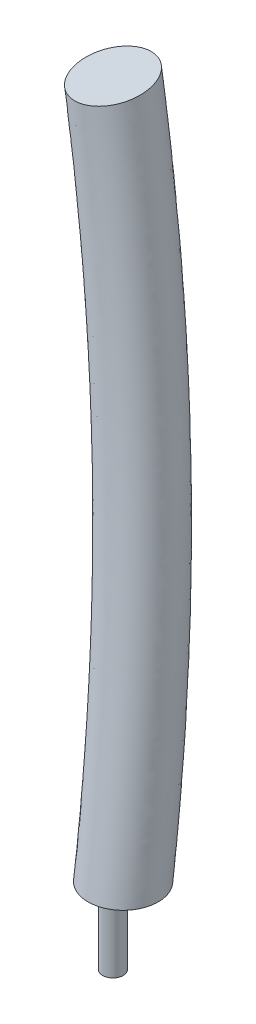
ISO-10303-21;
HEADER;
FILE_DESCRIPTION(('STEP AP214'),'2;1');
FILE_NAME('part.step','',(''),(''),'','','');
FILE_SCHEMA(('AUTOMOTIVE_DESIGN { 1 0 10303 214 1 1 1 1 }'));
ENDSEC;
DATA;
#1=APPLICATION_CONTEXT('core data for automotive mechanical design processes');
#2=APPLICATION_PROTOCOL_DEFINITION('international standard','automotive_design',2000,#1);
#3=PRODUCT_CONTEXT('',#1,'mechanical');
#4=PRODUCT('Part','Part','',(#3));
#5=PRODUCT_RELATED_PRODUCT_CATEGORY('part','',(#4));
#6=PRODUCT_DEFINITION_FORMATION('','',#4);
#7=PRODUCT_DEFINITION_CONTEXT('part definition',#1,'design');
#8=PRODUCT_DEFINITION('design','',#6,#7);
#9=PRODUCT_DEFINITION_SHAPE('','',#8);
#10=(LENGTH_UNIT() NAMED_UNIT(*) SI_UNIT(.MILLI.,.METRE.));
#11=(NAMED_UNIT(*) PLANE_ANGLE_UNIT() SI_UNIT($,.RADIAN.));
#12=(NAMED_UNIT(*) SI_UNIT($,.STERADIAN.) SOLID_ANGLE_UNIT());
#13=UNCERTAINTY_MEASURE_WITH_UNIT(LENGTH_MEASURE(1.E-05),#10,'distance_accuracy_value','');
#14=(GEOMETRIC_REPRESENTATION_CONTEXT(3) GLOBAL_UNCERTAINTY_ASSIGNED_CONTEXT((#13)) GLOBAL_UNIT_ASSIGNED_CONTEXT((#10,
#11,#12)) REPRESENTATION_CONTEXT('',''));
#15=CARTESIAN_POINT('',(0.,0.,0.));
#16=DIRECTION('',(0.,0.,1.));
#17=DIRECTION('',(1.,0.,0.));
#18=AXIS2_PLACEMENT_3D('',#15,#16,#17);
#19=CARTESIAN_POINT('',(0.,0.,0.));
#20=DIRECTION('',(0.,1.,0.));
#21=DIRECTION('',(0.,0.,1.));
#22=AXIS2_PLACEMENT_3D('',#19,#20,#21);
#23=PLANE('',#22);
#24=CARTESIAN_POINT('',(1.00340008736,0.,0.));
#25=DIRECTION('',(0.,-1.,0.));
#26=DIRECTION('',(0.,0.,-1.));
#27=AXIS2_PLACEMENT_3D('',#24,#25,#26);
#28=CIRCLE('',#27,0.146623174374);
#29=CARTESIAN_POINT('',(1.00340008736,0.,-0.146623174374));
#30=VERTEX_POINT('',#29);
#31=EDGE_CURVE('E17',#30,#30,#28,.F.);
#32=ORIENTED_EDGE('',*,*,#31,.F.);
#33=EDGE_LOOP('',(#32));
#34=FACE_BOUND('',#33,.T.);
#35=ADVANCED_FACE('F14',(#34),#23,.F.);
#36=CARTESIAN_POINT('',(1.00340008736,0.5,0.));
#37=DIRECTION('',(0.,-1.,0.));
#38=DIRECTION('',(0.,0.,-1.));
#39=AXIS2_PLACEMENT_3D('',#36,#37,#38);
#40=CYLINDRICAL_SURFACE('',#39,0.146623174374);
#41=ORIENTED_EDGE('',*,*,#31,.T.);
#42=EDGE_LOOP('',(#41));
#43=FACE_BOUND('',#42,.T.);
#44=CARTESIAN_POINT('',(1.00340008736,1.,0.));
#45=DIRECTION('',(0.,-1.,0.));
#46=DIRECTION('',(0.,0.,-1.));
#47=AXIS2_PLACEMENT_3D('',#44,#45,#46);
#48=CIRCLE('',#47,0.146623174374);
#49=CARTESIAN_POINT('',(1.00340008736,1.,-0.146623174374));
#50=VERTEX_POINT('',#49);
#51=EDGE_CURVE('E26',#50,#50,#48,.F.);
#52=ORIENTED_EDGE('',*,*,#51,.F.);
#53=EDGE_LOOP('',(#52));
#54=FACE_BOUND('',#53,.T.);
#55=ADVANCED_FACE('F48',(#43,#54),#40,.T.);
#56=CARTESIAN_POINT('',(-0.987813341373,9.84483464318,-0.987813341373));
#57=DIRECTION('',(-0.151428996103013,0.976213588915081,0.155165356819013));
#58=DIRECTION('',(0.,-0.156975577572689,0.987602484831686));
#59=AXIS2_PLACEMENT_3D('',#56,#57,#58);
#60=PLANE('',#59);
#61=CARTESIAN_POINT('',(0.498737043407666,10.078341431587,-1.00615292165044));
#62=CARTESIAN_POINT('',(0.497725032690783,10.082591541877,-1.03387987868986));
#63=CARTESIAN_POINT('',(0.494373261988579,10.0864781248545,-1.06160314427991));
#64=CARTESIAN_POINT('',(0.483065210497733,10.0934102728523,-1.11625209516348));
#65=CARTESIAN_POINT('',(0.475099079707696,10.0964540181091,-1.14317594433818));
#66=CARTESIAN_POINT('',(0.454794698370169,10.1016029884781,-1.19538583893637));
#67=CARTESIAN_POINT('',(0.442461282069797,10.1037092455222,-1.22067365885934));
#68=CARTESIAN_POINT('',(0.413769288119272,10.1069276903036,-1.26892340689998));
#69=CARTESIAN_POINT('',(0.397410432484347,10.1080398093641,-1.29188517423278));
#70=CARTESIAN_POINT('',(0.361133996146727,10.1092383208552,-1.33482844247346));
#71=CARTESIAN_POINT('',(0.341216691621509,10.109324792853,-1.35481017444646));
#72=CARTESIAN_POINT('',(0.298385904460319,10.1084696644533,-1.39122961277405));
#73=CARTESIAN_POINT('',(0.275472164027475,10.1075279755472,-1.40766701387121));
#74=CARTESIAN_POINT('',(0.227316999190403,10.1046441371718,-1.43651911172321));
#75=CARTESIAN_POINT('',(0.202077178675149,10.1027026728967,-1.44893655406881));
#76=CARTESIAN_POINT('',(0.149938410571271,10.0978715786143,-1.46942528611574));
#77=CARTESIAN_POINT('',(0.123037374805347,10.0949807346766,-1.47749097634059));
#78=CARTESIAN_POINT('',(0.0683878509593497,10.0883358724088,-1.48901879240237));
#79=CARTESIAN_POINT('',(0.0406399171575683,10.0845824085693,-1.49248386585291));
#80=CARTESIAN_POINT('',(-0.014932231832681,10.0763178326587,-1.49472175857161));
#81=CARTESIAN_POINT('',(-0.0427564470211329,10.0718067205878,-1.49349457784076));
#82=CARTESIAN_POINT('',(-0.0977090277096719,10.0621517830399,-1.48638044405306));
#83=CARTESIAN_POINT('',(-0.124836935509163,10.0570075536514,-1.48049050313132));
#84=CARTESIAN_POINT('',(-0.177573211412269,10.0462418466842,-1.46422509332441));
#85=CARTESIAN_POINT('',(-0.203183482698281,10.040620989297,-1.45385538369066));
#86=CARTESIAN_POINT('',(-0.252213428377985,10.029051630843,-1.42891676616804));
#87=CARTESIAN_POINT('',(-0.275631562311368,10.0231029039707,-1.41434493427163));
#88=CARTESIAN_POINT('',(-0.319589595522292,10.0110509592068,-1.38142037230943));
#89=CARTESIAN_POINT('',(-0.340129815495306,10.0049477586182,-1.36306806407851));
#90=CARTESIAN_POINT('',(-0.377754009526942,9.99275892538686,-1.32310095524889));
#91=CARTESIAN_POINT('',(-0.394837644235653,9.98667329452675,-1.30148583468729));
#92=CARTESIAN_POINT('',(-0.425059846900371,9.97469319996006,-1.25560824027096));
#93=CARTESIAN_POINT('',(-0.438198748927434,9.96879872010305,-1.23134599083336));
#94=CARTESIAN_POINT('',(-0.460174262572766,9.95736158524339,-1.18083628520313));
#95=CARTESIAN_POINT('',(-0.469005449120234,9.95181938148791,-1.15458637356935));
#96=CARTESIAN_POINT('',(-0.482073904425944,9.94126132305159,-1.10091474723961));
#97=CARTESIAN_POINT('',(-0.486322259470486,9.93624422478881,-1.07349602795208));
#98=CARTESIAN_POINT('',(-0.488828504751866,9.93009889668952,-1.03727895795079));
#99=CARTESIAN_POINT('',(-0.489196855191389,9.92866898545131,-1.02864223728606));
#100=CARTESIAN_POINT('',(-0.489408716762604,9.92657291933562,-1.01566172228639));
#101=CARTESIAN_POINT('',(-0.489422362619063,9.92588152886055,-1.01132519760545));
#102=CARTESIAN_POINT('',(-0.489357004661403,9.92485736960208,-1.00481797657496));
#103=CARTESIAN_POINT('',(-0.489320889344233,9.92451803289411,-1.00264781425666));
#104=CARTESIAN_POINT('',(-0.489220078664886,9.92384375250099,-0.998307236178757));
#105=CARTESIAN_POINT('',(-0.489155378337223,9.9235088095895,-0.996136820440649));
#106=CARTESIAN_POINT('',(-0.488067005482243,9.91892942361387,-0.966263721296195));
#107=CARTESIAN_POINT('',(-0.484715335515416,9.91504245067363,-0.938538100945214));
#108=CARTESIAN_POINT('',(-0.473408949093362,9.90810863677796,-0.883880294389451));
#109=CARTESIAN_POINT('',(-0.465441427668377,9.90506416789673,-0.856950535319028));
#110=CARTESIAN_POINT('',(-0.445134285439064,9.89991470683309,-0.804734859067979));
#111=CARTESIAN_POINT('',(-0.43280097834672,9.89780836782769,-0.779446630109266));
#112=CARTESIAN_POINT('',(-0.404109020842538,9.89458981221074,-0.731196220338312));
#113=CARTESIAN_POINT('',(-0.387749963893745,9.89347769605254,-0.708234274774638));
#114=CARTESIAN_POINT('',(-0.351473692880197,9.89227921017724,-0.665291329025338));
#115=CARTESIAN_POINT('',(-0.331556896114455,9.89219272024115,-0.645309979739618));
#116=CARTESIAN_POINT('',(-0.28872624379176,9.89304779451462,-0.608890332503855));
#117=CARTESIAN_POINT('',(-0.265811988683068,9.893989495902,-0.592452507669299));
#118=CARTESIAN_POINT('',(-0.217656248756994,9.89687337021237,-0.563600074660188));
#119=CARTESIAN_POINT('',(-0.192416422829212,9.89881483444628,-0.551182626754302));
#120=CARTESIAN_POINT('',(-0.140277654085088,9.90364592871759,-0.530693893975715));
#121=CARTESIAN_POINT('',(-0.113376623758767,9.90653677229846,-0.522628206796289));
#122=CARTESIAN_POINT('',(-0.0587271055302983,9.91318163399333,-0.511100392622242));
#123=CARTESIAN_POINT('',(-0.0309791717295904,9.91693509779372,-0.507635318955309));
#124=CARTESIAN_POINT('',(0.0245929772589981,9.92519967366125,-0.505397425963911));
#125=CARTESIAN_POINT('',(0.052417192446908,9.92971078572869,-0.506624606641265));
#126=CARTESIAN_POINT('',(0.107369776114257,9.939365723859,-0.513738741186324));
#127=CARTESIAN_POINT('',(0.134497686816586,9.94450995390106,-0.519628683418865));
#128=CARTESIAN_POINT('',(0.187233962371867,9.95527566077405,-0.535894092975803));
#129=CARTESIAN_POINT('',(0.212844230726452,9.96089651731005,-0.546263800086054));
#130=CARTESIAN_POINT('',(0.261873862472814,9.97246580239057,-0.571202262346715));
#131=CARTESIAN_POINT('',(0.285291713239155,9.97841445266126,-0.585773888675796));
#132=CARTESIAN_POINT('',(0.329249815068812,9.99046638966751,-0.618698334904613));
#133=CARTESIAN_POINT('',(0.34979031379796,9.99656966304052,-0.637050829032725));
#134=CARTESIAN_POINT('',(0.387414616102335,10.0087585405761,-0.677018110931486));
#135=CARTESIAN_POINT('',(0.404498151293911,10.0148441433307,-0.698633151764844));
#136=CARTESIAN_POINT('',(0.434720356329718,10.0268241868225,-0.744510422503321));
#137=CARTESIAN_POINT('',(0.447859298571534,10.0327186407347,-0.76877246945911));
#138=CARTESIAN_POINT('',(0.469833540970283,10.0441552012349,-0.819279802171917));
#139=CARTESIAN_POINT('',(0.478664070846854,10.0496969113903,-0.845527249210006));
#140=CARTESIAN_POINT('',(0.491733005764225,10.0602543547525,-0.899194537820292));
#141=CARTESIAN_POINT('',(0.495981188292149,10.0652711871542,-0.926611752866058));
#142=CARTESIAN_POINT('',(0.499087914019308,10.0728850613985,-0.971482072373086));
#143=CARTESIAN_POINT('',(0.499369745560821,10.075684291809,-0.988818218443633));
#144=CARTESIAN_POINT('',(0.498737043407666,10.078341431587,-1.00615292165044));
#145=B_SPLINE_CURVE_WITH_KNOTS('',3,(#61,#62,#63,#64,#65,#66,#67,#68,#69,#70,#71,#72,#73,#74,
#75,#76,#77,#78,#79,#80,#81,#82,#83,#84,#85,#86,#87,#88,#89,#90,#91,#92,#93,#94,#95,#96,#97,#98,
#99,#100,#101,#102,#103,#104,#105,#106,#107,#108,#109,#110,#111,#112,#113,#114,#115,#116,#117,
#118,#119,#120,#121,#122,#123,#124,#125,#126,#127,#128,#129,#130,#131,#132,#133,#134,#135,#136,
#137,#138,#139,#140,#141,#142,#143,#144),.UNSPECIFIED.,.T.,.F.,(4,2,2,2,2,2,2,2,2,2,2,2,2,2,2,2,
2,2,2,2,2,2,2,2,2,2,2,2,2,2,2,2,2,2,2,2,2,2,2,2,2,4),(0.,0.0841521487425908,0.168484597573969,
0.252723987228866,0.336969195836838,0.421207868864078,0.505453794097606,0.589642058234721,
0.673938392112072,0.758180691252474,0.842422990375176,0.926719315125966,1.01090758838996,
1.09515458522146,1.17939218665225,1.26363805409264,1.34787678491516,1.43222133254318,
1.51636138229157,1.5426396982925,1.5558118932692,1.56240213777663,1.5689935275219,
1.65311857659446,1.73747812462062,1.82171616865091,1.90596272288234,1.99019940203887,
2.07444732114258,2.15863560254247,2.24293191915773,2.32717421827274,2.4114165174204,
2.49571285122747,2.57990111543547,2.66414704249861,2.74838571369775,2.83263092231488,
2.91687031196082,3.00120276110712,3.08535490953315,3.13796625525689),.UNSPECIFIED.);
#146=CARTESIAN_POINT('',(-0.489076297964,9.92317607476,-0.993966263021));
#147=VERTEX_POINT('',#146);
#148=EDGE_CURVE('E21',#147,#147,#145,.T.);
#149=ORIENTED_EDGE('',*,*,#148,.T.);
#150=EDGE_LOOP('',(#149));
#151=FACE_BOUND('',#150,.T.);
#152=ADVANCED_FACE('F44',(#151),#60,.T.);
#153=CARTESIAN_POINT('',(0.,1.,0.));
#154=DIRECTION('',(0.,-1.,0.));
#155=DIRECTION('',(0.,0.,-1.));
#156=AXIS2_PLACEMENT_3D('',#153,#154,#155);
#157=PLANE('',#156);
#158=ORIENTED_EDGE('',*,*,#51,.T.);
#159=EDGE_LOOP('',(#158));
#160=FACE_BOUND('',#159,.T.);
#161=CARTESIAN_POINT('',(0.492433486740033,1.,-0.156501870559402));
#162=CARTESIAN_POINT('',(0.492408274831167,1.,-0.16337649669204));
#163=CARTESIAN_POINT('',(0.492524933848074,1.,-0.170250440412901));
#164=CARTESIAN_POINT('',(0.493823935554285,1.,-0.204695431673327));
#165=CARTESIAN_POINT('',(0.497158121202797,1.,-0.23222469733788));
#166=CARTESIAN_POINT('',(0.508408541082775,0.999999999999996,-0.286693533509989));
#167=CARTESIAN_POINT('',(0.516385463129132,0.999999999999986,-0.313620292303333));
#168=CARTESIAN_POINT('',(0.536761047433327,1.00000000000001,-0.365791533748516));
#169=CARTESIAN_POINT('',(0.549165333802091,1.00000000000005,-0.391033827980207));
#170=CARTESIAN_POINT('',(0.578026866107362,1.00000000000005,-0.439040699429697));
#171=CARTESIAN_POINT('',(0.59447919834326,1.00000000000001,-0.461808232672109));
#172=CARTESIAN_POINT('',(0.630977942652851,0.999999999999987,-0.50425458890449));
#173=CARTESIAN_POINT('',(0.651024475902952,0.999999999999996,-0.523933307714903));
#174=CARTESIAN_POINT('',(0.694111326915534,1.,-0.5596185222639));
#175=CARTESIAN_POINT('',(0.717147734511327,1.,-0.575629740050751));
#176=CARTESIAN_POINT('',(0.765580075633909,0.999999999999999,-0.60356351383366));
#177=CARTESIAN_POINT('',(0.79097613191436,1.,-0.615485856966728));
#178=CARTESIAN_POINT('',(0.843419933021865,1.,-0.634915171233581));
#179=CARTESIAN_POINT('',(0.870468575524825,1.,-0.642419718680155));
#180=CARTESIAN_POINT('',(0.925476716525798,1.,-0.652806754600789));
#181=CARTESIAN_POINT('',(0.953437397374077,1.,-0.655682978586316));
#182=CARTESIAN_POINT('',(1.0094917055588,1.,-0.656722533553725));
#183=CARTESIAN_POINT('',(1.03758547568443,1.,-0.654878132234161));
#184=CARTESIAN_POINT('',(1.0931161578659,0.999999999999998,-0.646513638613538));
#185=CARTESIAN_POINT('',(1.12055188179903,0.999999999999993,-0.639985663365641));
#186=CARTESIAN_POINT('',(1.17404373215644,0.999999999999993,-0.622403891728009));
#187=CARTESIAN_POINT('',(1.20009446510196,0.999999999999998,-0.611333684503803));
#188=CARTESIAN_POINT('',(1.2499310638407,1.,-0.585006754179413));
#189=CARTESIAN_POINT('',(1.27372058761938,1.,-0.569756953227786));
#190=CARTESIAN_POINT('',(1.31850670756873,0.999999999999999,-0.535423172780857));
#191=CARTESIAN_POINT('',(1.33949145326402,1.,-0.516323730036095));
#192=CARTESIAN_POINT('',(1.37792935470474,1.,-0.474902264688207));
#193=CARTESIAN_POINT('',(1.39538733109106,0.999999999999999,-0.452584713370749));
#194=CARTESIAN_POINT('',(1.42633481428989,1.,-0.405293869330844));
#195=CARTESIAN_POINT('',(1.43981798967516,1.,-0.380316424902402));
#196=CARTESIAN_POINT('',(1.46237932065268,0.999999999999996,-0.328490849165009));
#197=CARTESIAN_POINT('',(1.47146174170935,0.999999999999984,-0.301644558238423));
#198=CARTESIAN_POINT('',(1.48768640862314,0.999999999999979,-0.23569820518747));
#199=CARTESIAN_POINT('',(1.49257845532363,0.999999999999994,-0.196013113273411));
#200=CARTESIAN_POINT('',(1.49283292864398,1.,-0.12834495898517));
#201=CARTESIAN_POINT('',(1.49056757186473,1.,-0.100340153828321));
#202=CARTESIAN_POINT('',(1.48137102953791,0.999999999999999,-0.0450640922328302));
#203=CARTESIAN_POINT('',(1.47443551425631,1.,-0.0177935409473065));
#204=CARTESIAN_POINT('',(1.45608130074229,1.,0.0351796077882867));
#205=CARTESIAN_POINT('',(1.44466424506769,1.,0.0608827757267465));
#206=CARTESIAN_POINT('',(1.41766900534286,1.,0.110003862647745));
#207=CARTESIAN_POINT('',(1.40209079243773,0.999999999999999,0.133421765781941));
#208=CARTESIAN_POINT('',(1.36724772020773,0.999999999999999,0.177260655074718));
#209=CARTESIAN_POINT('',(1.3479897408227,1.,0.197687110299941));
#210=CARTESIAN_POINT('',(1.30631599358636,1.,0.235015644603253));
#211=CARTESIAN_POINT('',(1.28390015231978,1.,0.251917641720625));
#212=CARTESIAN_POINT('',(1.23657505388566,1.,0.281703546097679));
#213=CARTESIAN_POINT('',(1.2116684615924,1.,0.294591688317807));
#214=CARTESIAN_POINT('',(1.16001579039938,1.,0.316029126815343));
#215=CARTESIAN_POINT('',(1.13326738049547,1.,0.324572805732509));
#216=CARTESIAN_POINT('',(1.07868319390047,1.,0.33707027192304));
#217=CARTESIAN_POINT('',(1.05084606577748,1.,0.341018154624122));
#218=CARTESIAN_POINT('',(0.994903456897874,1.,0.344201739953486));
#219=CARTESIAN_POINT('',(0.96679796788477,1.,0.343437297131154));
#220=CARTESIAN_POINT('',(0.910995168715318,1.,0.337213439927002));
#221=CARTESIAN_POINT('',(0.883300000553693,1.,0.331734818327027));
#222=CARTESIAN_POINT('',(0.829251903337396,1.,0.316229420199619));
#223=CARTESIAN_POINT('',(0.802897337710945,1.,0.30620834476052));
#224=CARTESIAN_POINT('',(0.752125006025103,1.,0.281855770900515));
#225=CARTESIAN_POINT('',(0.727715802143448,1.,0.267506418486882));
#226=CARTESIAN_POINT('',(0.68164818251602,1.,0.234922420291656));
#227=CARTESIAN_POINT('',(0.659989581169992,1.,0.216688036879814));
#228=CARTESIAN_POINT('',(0.619991324370044,1.,0.176807503786528));
#229=CARTESIAN_POINT('',(0.601658630016356,1.,0.15515437176333));
#230=CARTESIAN_POINT('',(0.568891542013408,1.,0.109077473662012));
#231=CARTESIAN_POINT('',(0.554456876489219,1.,0.0846539009820022));
#232=CARTESIAN_POINT('',(0.529892789450153,1.,0.0337151480538975));
#233=CARTESIAN_POINT('',(0.519765744180759,1.,0.0071988229009854));
#234=CARTESIAN_POINT('',(0.504139882093954,1.,-0.0471178575923001));
#235=CARTESIAN_POINT('',(0.498632221499227,1.,-0.0749156513816238));
#236=CARTESIAN_POINT('',(0.493523935798153,1.,-0.120743972792176));
#237=CARTESIAN_POINT('',(0.492499047288579,1.,-0.138625228902217));
#238=CARTESIAN_POINT('',(0.492433486740033,1.,-0.156501870559402));
#239=B_SPLINE_CURVE_WITH_KNOTS('',3,(#161,#162,#163,#164,#165,#166,#167,#168,#169,#170,#171,
#172,#173,#174,#175,#176,#177,#178,#179,#180,#181,#182,#183,#184,#185,#186,#187,#188,#189,#190,
#191,#192,#193,#194,#195,#196,#197,#198,#199,#200,#201,#202,#203,#204,#205,#206,#207,#208,#209,
#210,#211,#212,#213,#214,#215,#216,#217,#218,#219,#220,#221,#222,#223,#224,#225,#226,#227,#228,
#229,#230,#231,#232,#233,#234,#235,#236,#237,#238),.UNSPECIFIED.,.T.,.F.,(4,2,2,2,2,2,2,2,2,2,2,
2,2,2,2,2,2,2,2,2,2,2,2,2,2,2,2,2,2,2,2,2,2,2,2,2,2,2,4),(0.,0.0206227272919411,
0.10338106809475,0.187246290094736,0.271218428051227,0.355089135391487,0.438962670916013,
0.522727601304242,0.606496891754723,0.690312096913401,0.774240651774377,0.858306768084527,
0.942514709428614,1.02702960653087,1.11140536908261,1.1961270601266,1.28073215204905,
1.36547129141454,1.45012813160669,1.56883985173711,1.65276876643856,1.73677559950523,
1.82075167140005,1.90472832562869,1.98854948113455,2.07237258567085,2.15610694767053,
2.23994930404961,2.32389926067139,2.40785180850506,2.49214803689285,2.57633875946793,
2.66088162867042,2.74541879020556,2.83013089597982,2.91483709183124,2.99958995439932,
3.08418018545076,3.13780711710913),.UNSPECIFIED.);
#240=CARTESIAN_POINT('',(0.492433486740033,1.,-0.156501870559402));
#241=VERTEX_POINT('',#240);
#242=EDGE_CURVE('E10',#241,#241,#239,.T.);
#243=ORIENTED_EDGE('',*,*,#242,.T.);
#244=EDGE_LOOP('',(#243));
#245=FACE_BOUND('',#244,.T.);
#246=ADVANCED_FACE('F41',(#160,#245),#157,.T.);
#247=CARTESIAN_POINT('',(0.504889965057,0.,0.));
#248=CARTESIAN_POINT('',(0.504889965057,0.,2.));
#249=CARTESIAN_POINT('',(2.50488996506,0.,1.));
#250=CARTESIAN_POINT('',(2.50488996506,0.,-1.));
#251=CARTESIAN_POINT('',(0.504889965057,0.,-2.));
#252=CARTESIAN_POINT('',(0.504889965057,0.,0.));
#253=CARTESIAN_POINT('',(0.50488996501,1.97549073555,-0.310309377184));
#254=CARTESIAN_POINT('',(0.520014698956,1.97549073576,1.6896906227));
#255=CARTESIAN_POINT('',(2.51245233218,2.07177779006,0.674565886287));
#256=CARTESIAN_POINT('',(2.49732759823,2.07177778985,-1.32543411363));
#257=CARTESIAN_POINT('',(0.489765231063,1.97549073534,-2.31030937714));
#258=CARTESIAN_POINT('',(0.50488996501,1.97549073555,-0.310309377184));
#259=CARTESIAN_POINT('',(0.383072766866,3.95086743427,-0.621344711022));
#260=CARTESIAN_POINT('',(0.410389786477,3.91397851344,1.3785123338));
#261=CARTESIAN_POINT('',(2.39079362988,4.12545773536,0.351266946165));
#262=CARTESIAN_POINT('',(2.36347664778,4.16234665619,-1.64859008734));
#263=CARTESIAN_POINT('',(0.355755747254,3.98775635509,-2.62120190945));
#264=CARTESIAN_POINT('',(0.383072766866,3.95086743427,-0.621344711022));
#265=CARTESIAN_POINT('',(0.139911926067,5.91897164571,-0.869002171082));
#266=CARTESIAN_POINT('',(0.178868807035,5.80708084448,1.13104424532));
#267=CARTESIAN_POINT('',(2.14126145955,6.13336817352,0.10372942683));
#268=CARTESIAN_POINT('',(2.10230469535,6.2452585131,-1.89631707554));
#269=CARTESIAN_POINT('',(0.100955102707,6.03086198687,-2.86904863974));
#270=CARTESIAN_POINT('',(0.139911926067,5.91897164571,-0.869002171082));
#271=CARTESIAN_POINT('',(-0.173855073273,7.9164155498,-0.993966262741));
#272=CARTESIAN_POINT('',(-0.116907077659,7.70903869746,0.99684359483));
#273=CARTESIAN_POINT('',(1.83043063989,8.12187988584,-0.0229346525329));
#274=CARTESIAN_POINT('',(1.77348264386,8.32925673817,-2.01374450981));
#275=CARTESIAN_POINT('',(-0.230803068936,8.12379240292,-2.98477611983));
#276=CARTESIAN_POINT('',(-0.173855073273,7.9164155498,-0.993966262741));
#277=CARTESIAN_POINT('',(-0.489076297964,9.92317607476,-0.993966263021));
#278=CARTESIAN_POINT('',(-0.417130158541,9.62031808256,0.981660419725));
#279=CARTESIAN_POINT('',(1.52252345449,10.0820777923,-0.030526238902));
#280=CARTESIAN_POINT('',(1.45057731507,10.3849357845,-2.00615292165));
#281=CARTESIAN_POINT('',(-0.561022437387,10.226034067,-2.96959294577));
#282=CARTESIAN_POINT('',(-0.489076297964,9.92317607476,-0.993966263021));
#283=(BOUNDED_SURFACE() B_SPLINE_SURFACE(5,5,((#247,#248,#249,#250,#251,#252),(#253,#254,#255,
#256,#257,#258),(#259,#260,#261,#262,#263,#264),(#265,#266,#267,#268,#269,#270),(#271,#272,#273,
#274,#275,#276),(#277,#278,#279,#280,#281,#282)),.UNSPECIFIED.,.F.,.T.,
.F.) B_SPLINE_SURFACE_WITH_KNOTS((6,6),(6,6),(0.,10.1637294795),(0.,3.14159265359),
.UNSPECIFIED.) GEOMETRIC_REPRESENTATION_ITEM() RATIONAL_B_SPLINE_SURFACE(((1.,0.2,0.2,0.2,0.2,
1.),(1.,0.2,0.2,0.2,0.2,1.),(1.,0.2,0.2,0.2,0.2,1.),(1.,0.2,0.2,0.2,0.2,1.),(1.,0.2,0.2,0.2,0.2,
1.),(1.,0.2,0.2,0.2,0.2,1.))) REPRESENTATION_ITEM('') SURFACE());
#284=CARTESIAN_POINT('',(-0.489076297964,9.92317607476,-0.993966263021));
#285=CARTESIAN_POINT('',(-0.481699526901624,9.87621410504848,-0.993966276265207));
#286=CARTESIAN_POINT('',(-0.474322753134308,9.82925213581436,-0.993884139897679));
#287=CARTESIAN_POINT('',(-0.459574932288969,9.73534150416555,-0.993555706604962));
#288=CARTESIAN_POINT('',(-0.452203884180645,9.68839284175,-0.993309456191078));
#289=CARTESIAN_POINT('',(-0.437471304172398,9.59450980310495,-0.992653033213249));
#290=CARTESIAN_POINT('',(-0.430109770059825,9.54757542687388,-0.992242910534571));
#291=CARTESIAN_POINT('',(-0.415399975216795,9.45372185659264,-0.991259088004933));
#292=CARTESIAN_POINT('',(-0.408051710964583,9.40680266253964,-0.99068544107979));
#293=CARTESIAN_POINT('',(-0.393372183059075,9.31298027099531,-0.989374995381482));
#294=CARTESIAN_POINT('',(-0.386040914467158,9.26607707349948,-0.988638252253619));
#295=CARTESIAN_POINT('',(-0.371399073595069,9.17228741014623,-0.987002125390471));
#296=CARTESIAN_POINT('',(-0.364088494871038,9.12540094428216,-0.986102799702471));
#297=CARTESIAN_POINT('',(-0.349491697451581,9.03164540212712,-0.984142101929522));
#298=CARTESIAN_POINT('',(-0.342205470736952,8.98477632582699,-0.983080789983348));
#299=CARTESIAN_POINT('',(-0.327661008283629,8.89105614579411,-0.98079679620791));
#300=CARTESIAN_POINT('',(-0.320402762897851,8.84420504204934,-0.979574176305342));
#301=CARTESIAN_POINT('',(-0.305917860582878,8.75052131737215,-0.976968324156375));
#302=CARTESIAN_POINT('',(-0.298691192342932,8.70368869642453,-0.975585155328825));
#303=CARTESIAN_POINT('',(-0.284273007616981,8.61004237703114,-0.972659042779511));
#304=CARTESIAN_POINT('',(-0.277081478136734,8.56322867856677,-0.971116163681332));
#305=CARTESIAN_POINT('',(-0.262737099333871,8.46962057546699,-0.967871546791284));
#306=CARTESIAN_POINT('',(-0.255584235328857,8.42282617080944,-0.966169874549265));
#307=CARTESIAN_POINT('',(-0.241320680275443,8.32925696048139,-0.962608665174674));
#308=CARTESIAN_POINT('',(-0.234209972866185,8.28248215478511,-0.960749194249231));
#309=CARTESIAN_POINT('',(-0.22003418748873,8.1889523835619,-0.956873457761588));
#310=CARTESIAN_POINT('',(-0.212969091504458,8.14219741800555,-0.954857258804795));
#311=CARTESIAN_POINT('',(-0.198887948437753,8.04870750646202,-0.950669211807293));
#312=CARTESIAN_POINT('',(-0.191871881720013,8.00197256044185,-0.948497430521717));
#313=CARTESIAN_POINT('',(-0.177892178915195,7.9085228077813,-0.943999438566258));
#314=CARTESIAN_POINT('',(-0.170928521621491,7.86180800110449,-0.941673294563552));
#315=CARTESIAN_POINT('',(-0.157056980954136,7.76839858954539,-0.936867869867579));
#316=CARTESIAN_POINT('',(-0.150149074861564,7.72170398462343,-0.934388655527102));
#317=CARTESIAN_POINT('',(-0.136392340739777,7.62833498378618,-0.929278454690451));
#318=CARTESIAN_POINT('',(-0.129543488548661,7.58166058782824,-0.926647534017846));
#319=CARTESIAN_POINT('',(-0.115908126521171,7.48833195912194,-0.921235355739584));
#320=CARTESIAN_POINT('',(-0.109121591158706,7.44167772632826,-0.91845416322534));
#321=CARTESIAN_POINT('',(-0.0956140865229682,7.34838932733746,-0.912742946020585));
#322=CARTESIAN_POINT('',(-0.0888930904468594,7.30175516109273,-0.909812985498558));
#323=CARTESIAN_POINT('',(-0.0755198468571649,7.20850674996422,-0.903805805415296));
#324=CARTESIAN_POINT('',(-0.068867571359274,7.16189250503094,-0.900728648921214));
#325=CARTESIAN_POINT('',(-0.0556349094348615,7.06868374486055,-0.894428717257091));
#326=CARTESIAN_POINT('',(-0.049054493944856,7.02208922957249,-0.891206003887028));
#327=CARTESIAN_POINT('',(-0.0359686498780328,6.92891969279189,-0.88461666490614));
#328=CARTESIAN_POINT('',(-0.0294631912670405,6.8823446712474,-0.881250099674964));
#329=CARTESIAN_POINT('',(-0.0165303154313081,6.7892138440109,-0.874374828324629));
#330=CARTESIAN_POINT('',(-0.0101028673155741,6.74265803826641,-0.870866181024426));
#331=CARTESIAN_POINT('',(0.00267097712623925,6.64956532483782,-0.863708580651948));
#332=CARTESIAN_POINT('',(0.0090174050816861,6.60302841710117,-0.860059684710415));
#333=CARTESIAN_POINT('',(0.0216262435692858,6.50997314424057,-0.85262348477984));
#334=CARTESIAN_POINT('',(0.0278886863469639,6.46345477906449,-0.848836236118654));
#335=CARTESIAN_POINT('',(0.0403266343144439,6.37043620041515,-0.841125289927504));
#336=CARTESIAN_POINT('',(0.0465021722407393,6.32393598689063,-0.837201645820669));
#337=CARTESIAN_POINT('',(0.0587634365084279,6.23095328736583,-0.829219928216683));
#338=CARTESIAN_POINT('',(0.0648491959499093,6.18447080131558,-0.825161906148845));
#339=CARTESIAN_POINT('',(0.0769280761162104,6.09152310148546,-0.816913511246693));
#340=CARTESIAN_POINT('',(0.0829212301759341,6.04505788765733,-0.812723187771436));
#341=CARTESIAN_POINT('',(0.0948121200091587,5.95214424813578,-0.804212326669434));
#342=CARTESIAN_POINT('',(0.100709889222964,5.9056958223962,-0.799891836267549));
#343=CARTESIAN_POINT('',(0.112407278053157,5.81281524822777,-0.791122834764361));
#344=CARTESIAN_POINT('',(0.118206931085955,5.76638309975517,-0.786674368702093));
#345=CARTESIAN_POINT('',(0.129705405196711,5.67353454480191,-0.777651665013422));
#346=CARTESIAN_POINT('',(0.135404259538755,5.62711813828022,-0.773077470200691));
#347=CARTESIAN_POINT('',(0.146698503559032,5.53430050960862,-0.763805612675968));
#348=CARTESIAN_POINT('',(0.152293926222184,5.48789928742065,-0.759107990524567));
#349=CARTESIAN_POINT('',(0.163378724518104,5.39511144968852,-0.749591635363627));
#350=CARTESIAN_POINT('',(0.168868132732084,5.34872483410947,-0.744772940645399));
#351=CARTESIAN_POINT('',(0.179738370798726,5.25596561395291,-0.735016849615146));
#352=CARTESIAN_POINT('',(0.185119232707353,5.2095930093438,-0.730079489320145));
#353=CARTESIAN_POINT('',(0.195769898560545,5.11686119976404,-0.720088527471217));
#354=CARTESIAN_POINT('',(0.201039733917957,5.07050199476521,-0.715034959665836));
#355=CARTESIAN_POINT('',(0.21146591948605,4.97779635951562,-0.704814093049255));
#356=CARTESIAN_POINT('',(0.216622300352916,4.93144992924014,-0.699646825734346));
#357=CARTESIAN_POINT('',(0.226819202868559,4.83876920721312,-0.689201119118169));
#358=CARTESIAN_POINT('',(0.231859754308273,4.79243491544031,-0.683922709087134));
#359=CARTESIAN_POINT('',(0.241822677700173,4.69977782505427,-0.673257323673088));
#360=CARTESIAN_POINT('',(0.246745078475031,4.65345502642314,-0.667870375369959));
#361=CARTESIAN_POINT('',(0.256469434759711,4.56082027000941,-0.656990566510078));
#362=CARTESIAN_POINT('',(0.261271418027075,4.51450831221217,-0.651497730887573));
#363=CARTESIAN_POINT('',(0.27075272870062,4.42189458040197,-0.640408845800826));
#364=CARTESIAN_POINT('',(0.275432082709061,4.3755928063775,-0.634812819178393));
#365=CARTESIAN_POINT('',(0.284665980138854,4.28299878248892,-0.623520294667301));
#366=CARTESIAN_POINT('',(0.289220548924279,4.23670653261623,-0.617823817589145));
#367=CARTESIAN_POINT('',(0.298202777740736,4.14413089704114,-0.6063331777564));
#368=CARTESIAN_POINT('',(0.302630461822498,4.09784751133288,-0.600539033849489));
#369=CARTESIAN_POINT('',(0.311356880310785,4.00528894592397,-0.588855887814564));
#370=CARTESIAN_POINT('',(0.315655637387771,3.95901376621991,-0.582966902646631));
#371=CARTESIAN_POINT('',(0.324122218879522,3.86647095867759,-0.571096942262385));
#372=CARTESIAN_POINT('',(0.328290064526224,3.8202033308381,-0.565115982199906));
#373=CARTESIAN_POINT('',(0.336492898791243,3.7276749790975,-0.553064979769185));
#374=CARTESIAN_POINT('',(0.340527907153807,3.68141425519705,-0.546994950835351));
#375=CARTESIAN_POINT('',(0.348463201791768,3.58889907181501,-0.534768756827583));
#376=CARTESIAN_POINT('',(0.352363506284028,3.54264461233565,-0.52861260356026));
#377=CARTESIAN_POINT('',(0.360027588116159,3.45014132887767,-0.516217144328046));
#378=CARTESIAN_POINT('',(0.36379138211564,3.40389250490253,-0.509977848637721));
#379=CARTESIAN_POINT('',(0.371180698576409,3.31139987632973,-0.497419124133424));
#380=CARTESIAN_POINT('',(0.37480623612032,3.26515607173651,-0.491099704161144));
#381=CARTESIAN_POINT('',(0.381917356649098,3.17267288079266,-0.478383785653473));
#382=CARTESIAN_POINT('',(0.385402953130297,3.12643349444711,-0.471987294628775));
#383=CARTESIAN_POINT('',(0.392232570563029,3.03395855604555,-0.459120322419359));
#384=CARTESIAN_POINT('',(0.395576603425967,2.98772300399496,-0.452649847518192));
#385=CARTESIAN_POINT('',(0.402121535386818,2.89525516960561,-0.439638028658162));
#386=CARTESIAN_POINT('',(0.405322444823461,2.84902288727232,-0.4330966898608));
#387=CARTESIAN_POINT('',(0.411579635116469,2.75656104930862,-0.419946295867359));
#388=CARTESIAN_POINT('',(0.414635924762201,2.71033149368349,-0.413337244816314));
#389=CARTESIAN_POINT('',(0.420602444762902,2.61787458988939,-0.400054609389304));
#390=CARTESIAN_POINT('',(0.42351268239239,2.57164724172528,-0.393381028247223));
#391=CARTESIAN_POINT('',(0.429185732439478,2.47919425956221,-0.3799725449857));
#392=CARTESIAN_POINT('',(0.431948550662574,2.4329686255675,-0.373237645293277));
#393=CARTESIAN_POINT('',(0.437325461449391,2.34051860660133,-0.359709765412051));
#394=CARTESIAN_POINT('',(0.439939558406784,2.29429422163334,-0.352916786945897));
#395=CARTESIAN_POINT('',(0.445017792373422,2.20184626592133,-0.33927601699216));
#396=CARTESIAN_POINT('',(0.447481932433123,2.15562269517987,-0.332428226622781));
#397=CARTESIAN_POINT('',(0.452259085156172,2.06317596565761,-0.318681126192438));
#398=CARTESIAN_POINT('',(0.454572099606767,2.01695280687841,-0.311781816741827));
#399=CARTESIAN_POINT('',(0.459045901197825,1.92450653374689,-0.297934996196878));
#400=CARTESIAN_POINT('',(0.461206688953684,1.87828341939515,-0.290987485297527));
#401=CARTESIAN_POINT('',(0.465375005425122,1.78583690450731,-0.277047603479554));
#402=CARTESIAN_POINT('',(0.467382533686883,1.73961350397077,-0.270055232428163));
#403=CARTESIAN_POINT('',(0.471243368439749,1.64716612521979,-0.256028994386318));
#404=CARTESIAN_POINT('',(0.473096673521614,1.60094214700393,-0.248995127017314));
#405=CARTESIAN_POINT('',(0.476648168377691,1.50849336270527,-0.234889281682183));
#406=CARTESIAN_POINT('',(0.47834635591203,1.46226855662016,-0.227817303167298));
#407=CARTESIAN_POINT('',(0.48158679384709,1.36981790991661,-0.213638641226764));
#408=CARTESIAN_POINT('',(0.483129041312932,1.32359206929507,-0.206531957150575));
#409=CARTESIAN_POINT('',(0.486056842840868,1.23113919247615,-0.192287308171768));
#410=CARTESIAN_POINT('',(0.487442393419146,1.18491215627505,-0.185149342577338));
#411=CARTESIAN_POINT('',(0.490056136671979,1.09245677541583,-0.170845574942325));
#412=CARTESIAN_POINT('',(0.491284325470751,1.04622843075353,-0.163679772220596));
#413=CARTESIAN_POINT('',(0.492433486740033,1.,-0.156501870559402));
#414=B_SPLINE_CURVE_WITH_KNOTS('',3,(#284,#285,#286,#287,#288,#289,#290,#291,#292,#293,#294,
#295,#296,#297,#298,#299,#300,#301,#302,#303,#304,#305,#306,#307,#308,#309,#310,#311,#312,#313,
#314,#315,#316,#317,#318,#319,#320,#321,#322,#323,#324,#325,#326,#327,#328,#329,#330,#331,#332,
#333,#334,#335,#336,#337,#338,#339,#340,#341,#342,#343,#344,#345,#346,#347,#348,#349,#350,#351,
#352,#353,#354,#355,#356,#357,#358,#359,#360,#361,#362,#363,#364,#365,#366,#367,#368,#369,#370,
#371,#372,#373,#374,#375,#376,#377,#378,#379,#380,#381,#382,#383,#384,#385,#386,#387,#388,#389,
#390,#391,#392,#393,#394,#395,#396,#397,#398,#399,#400,#401,#402,#403,#404,#405,#406,#407,#408,
#409,#410,#411,#412,#413),.UNSPECIFIED.,.F.,.F.,(4,2,2,2,2,2,2,2,2,2,2,2,2,2,2,2,2,2,2,2,2,2,2,
2,2,2,2,2,2,2,2,2,2,2,2,2,2,2,2,2,2,2,2,2,2,2,2,2,2,2,2,2,2,2,2,2,2,2,2,2,2,2,2,2,4),(0.,
0.142613358049001,0.28518631544762,0.427715904444339,0.570199414972978,0.712634387571204,
0.855018606303794,0.997350091692505,1.13962709365436,1.28184808445,1.42401175164369,
1.56611699107631,1.70816289985279,1.85014876934513,1.99207407821204,2.13393848543638,
2.2757418233811,2.41748409086453,2.55916544625575,2.70078620059051,2.84234681070827,
2.98384787241065,3.12529011364158,3.26667438768934,3.40800166641054,3.54927303347608,
3.69048967763879,3.83165288602284,3.97276403743429,4.11382459569276,4.25483610298336,
4.39580017322871,4.53671848548015,4.6775927773276,4.81842483832727,4.95921650344629,
5.09996964652354,5.24068617374559,5.3813680171367,5.52201712806201,5.66263547074262,
5.80322501578142,5.94378773369866,6.08432558847579,6.22484053110648,6.36533449315352,
6.50580938031022,6.64626706596513,6.78670938476867,6.92713812620033,7.06755502813528,
7.20796177040886,7.34835996837778,7.48875116647676,7.62913683176926,7.76951834749114,
7.90989700658597,8.05027400523086,8.19065043635176,8.3310272831269,8.47140541247759,
8.61178556854526,8.7521683661538,8.89255428425634,9.0329436593657),.UNSPECIFIED.);
#415=EDGE_CURVE('BSEAM37',#147,#241,#414,.T.);
#416=ORIENTED_EDGE('',*,*,#148,.F.);
#417=ORIENTED_EDGE('',*,*,#242,.F.);
#418=ORIENTED_EDGE('',*,*,#415,.T.);
#419=ORIENTED_EDGE('',*,*,#415,.F.);
#420=EDGE_LOOP('',(#416,#418,#417,#419));
#421=FACE_BOUND('',#420,.T.);
#422=ADVANCED_FACE('F37',(#421),#283,.F.);
#423=CLOSED_SHELL('',(#35,#55,#152,#246,#422));
#424=MANIFOLD_SOLID_BREP('B1',#423);
#425=ADVANCED_BREP_SHAPE_REPRESENTATION('',(#18,#424),#14);
#426=SHAPE_DEFINITION_REPRESENTATION(#9,#425);
ENDSEC;
END-ISO-10303-21;
